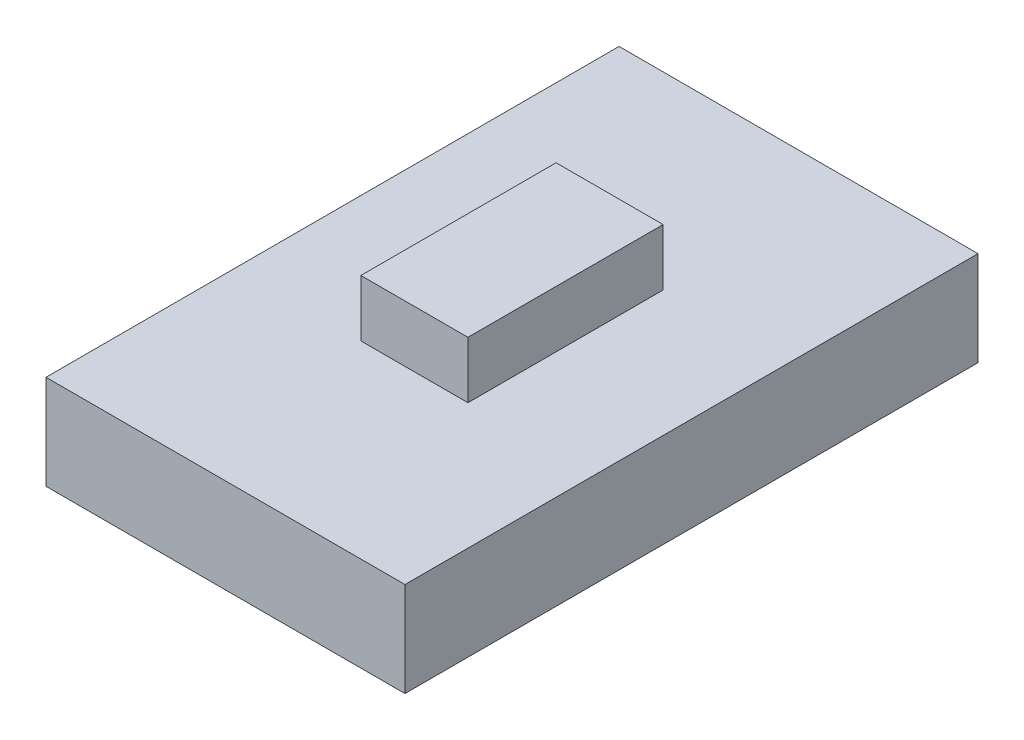
ISO-10303-21;
HEADER;
FILE_DESCRIPTION(('STEP AP214'),'2;1');
FILE_NAME('part.step','',(''),(''),'','','');
FILE_SCHEMA(('AUTOMOTIVE_DESIGN { 1 0 10303 214 1 1 1 1 }'));
ENDSEC;
DATA;
#1=APPLICATION_CONTEXT('core data for automotive mechanical design processes');
#2=APPLICATION_PROTOCOL_DEFINITION('international standard','automotive_design',2000,#1);
#3=PRODUCT_CONTEXT('',#1,'mechanical');
#4=PRODUCT('Part','Part','',(#3));
#5=PRODUCT_RELATED_PRODUCT_CATEGORY('part','',(#4));
#6=PRODUCT_DEFINITION_FORMATION('','',#4);
#7=PRODUCT_DEFINITION_CONTEXT('part definition',#1,'design');
#8=PRODUCT_DEFINITION('design','',#6,#7);
#9=PRODUCT_DEFINITION_SHAPE('','',#8);
#10=(LENGTH_UNIT() NAMED_UNIT(*) SI_UNIT(.MILLI.,.METRE.));
#11=(NAMED_UNIT(*) PLANE_ANGLE_UNIT() SI_UNIT($,.RADIAN.));
#12=(NAMED_UNIT(*) SI_UNIT($,.STERADIAN.) SOLID_ANGLE_UNIT());
#13=UNCERTAINTY_MEASURE_WITH_UNIT(LENGTH_MEASURE(1.E-05),#10,'distance_accuracy_value','');
#14=(GEOMETRIC_REPRESENTATION_CONTEXT(3) GLOBAL_UNCERTAINTY_ASSIGNED_CONTEXT((#13)) GLOBAL_UNIT_ASSIGNED_CONTEXT((#10,
#11,#12)) REPRESENTATION_CONTEXT('',''));
#15=CARTESIAN_POINT('',(0.,0.,0.));
#16=DIRECTION('',(0.,0.,1.));
#17=DIRECTION('',(1.,0.,0.));
#18=AXIS2_PLACEMENT_3D('',#15,#16,#17);
#19=CARTESIAN_POINT('',(0.85,0.45,0.));
#20=DIRECTION('',(0.,0.,-1.));
#21=DIRECTION('',(-1.,0.,0.));
#22=AXIS2_PLACEMENT_3D('',#19,#20,#21);
#23=PLANE('',#22);
#24=DIRECTION('',(1.,0.,0.));
#25=VECTOR('',#24,1.);
#26=CARTESIAN_POINT('',(0.85,0.,0.));
#27=LINE('',#26,#25);
#28=CARTESIAN_POINT('',(0.,0.,0.));
#29=VERTEX_POINT('',#28);
#30=CARTESIAN_POINT('',(0.85,0.,0.));
#31=VERTEX_POINT('',#30);
#32=EDGE_CURVE('E112',#29,#31,#27,.T.);
#33=ORIENTED_EDGE('',*,*,#32,.T.);
#34=DIRECTION('',(0.,-1.,0.));
#35=VECTOR('',#34,1.);
#36=CARTESIAN_POINT('',(0.85,0.45,0.));
#37=LINE('',#36,#35);
#38=CARTESIAN_POINT('',(0.85,0.45,0.));
#39=VERTEX_POINT('',#38);
#40=EDGE_CURVE('E11',#39,#31,#37,.T.);
#41=ORIENTED_EDGE('',*,*,#40,.F.);
#42=DIRECTION('',(1.,0.,0.));
#43=VECTOR('',#42,1.);
#44=CARTESIAN_POINT('',(0.85,0.45,0.));
#45=LINE('',#44,#43);
#46=CARTESIAN_POINT('',(0.,0.45,0.));
#47=VERTEX_POINT('',#46);
#48=EDGE_CURVE('E136',#47,#39,#45,.T.);
#49=ORIENTED_EDGE('',*,*,#48,.F.);
#50=DIRECTION('',(0.,-1.,0.));
#51=VECTOR('',#50,1.);
#52=CARTESIAN_POINT('',(0.,0.45,0.));
#53=LINE('',#52,#51);
#54=EDGE_CURVE('E144',#47,#29,#53,.T.);
#55=ORIENTED_EDGE('',*,*,#54,.T.);
#56=EDGE_LOOP('',(#33,#41,#49,#55));
#57=FACE_BOUND('',#56,.T.);
#58=ADVANCED_FACE('F34',(#57),#23,.F.);
#59=CARTESIAN_POINT('',(0.85,0.45,-1.55));
#60=DIRECTION('',(-1.,0.,0.));
#61=DIRECTION('',(0.,0.,1.));
#62=AXIS2_PLACEMENT_3D('',#59,#60,#61);
#63=PLANE('',#62);
#64=DIRECTION('',(0.,0.,-1.));
#65=VECTOR('',#64,1.);
#66=CARTESIAN_POINT('',(0.85,0.,-1.55));
#67=LINE('',#66,#65);
#68=CARTESIAN_POINT('',(0.85,0.,-1.55));
#69=VERTEX_POINT('',#68);
#70=EDGE_CURVE('E147',#31,#69,#67,.T.);
#71=ORIENTED_EDGE('',*,*,#70,.T.);
#72=DIRECTION('',(0.,-1.,0.));
#73=VECTOR('',#72,1.);
#74=CARTESIAN_POINT('',(0.85,0.45,-1.55));
#75=LINE('',#74,#73);
#76=CARTESIAN_POINT('',(0.85,0.45,-1.55));
#77=VERTEX_POINT('',#76);
#78=EDGE_CURVE('E42',#77,#69,#75,.T.);
#79=ORIENTED_EDGE('',*,*,#78,.F.);
#80=DIRECTION('',(0.,0.,-1.));
#81=VECTOR('',#80,1.);
#82=CARTESIAN_POINT('',(0.85,0.45,-1.55));
#83=LINE('',#82,#81);
#84=EDGE_CURVE('E138',#39,#77,#83,.T.);
#85=ORIENTED_EDGE('',*,*,#84,.F.);
#86=ORIENTED_EDGE('',*,*,#40,.T.);
#87=EDGE_LOOP('',(#71,#79,#85,#86));
#88=FACE_BOUND('',#87,.T.);
#89=ADVANCED_FACE('F167',(#88),#63,.F.);
#90=CARTESIAN_POINT('',(0.,0.45,-1.55));
#91=DIRECTION('',(0.,0.,1.));
#92=DIRECTION('',(1.,0.,0.));
#93=AXIS2_PLACEMENT_3D('',#90,#91,#92);
#94=PLANE('',#93);
#95=DIRECTION('',(-1.,0.,0.));
#96=VECTOR('',#95,1.);
#97=CARTESIAN_POINT('',(0.,0.,-1.55));
#98=LINE('',#97,#96);
#99=CARTESIAN_POINT('',(0.,0.,-1.55));
#100=VERTEX_POINT('',#99);
#101=EDGE_CURVE('E150',#69,#100,#98,.T.);
#102=ORIENTED_EDGE('',*,*,#101,.T.);
#103=DIRECTION('',(0.,-1.,0.));
#104=VECTOR('',#103,1.);
#105=CARTESIAN_POINT('',(0.,0.45,-1.55));
#106=LINE('',#105,#104);
#107=CARTESIAN_POINT('',(0.,0.45,-1.55));
#108=VERTEX_POINT('',#107);
#109=EDGE_CURVE('E157',#108,#100,#106,.T.);
#110=ORIENTED_EDGE('',*,*,#109,.F.);
#111=DIRECTION('',(-1.,0.,0.));
#112=VECTOR('',#111,1.);
#113=CARTESIAN_POINT('',(0.,0.45,-1.55));
#114=LINE('',#113,#112);
#115=EDGE_CURVE('E141',#77,#108,#114,.T.);
#116=ORIENTED_EDGE('',*,*,#115,.F.);
#117=ORIENTED_EDGE('',*,*,#78,.T.);
#118=EDGE_LOOP('',(#102,#110,#116,#117));
#119=FACE_BOUND('',#118,.T.);
#120=ADVANCED_FACE('F163',(#119),#94,.F.);
#121=CARTESIAN_POINT('',(0.,0.45,0.));
#122=DIRECTION('',(1.,0.,0.));
#123=DIRECTION('',(0.,0.,-1.));
#124=AXIS2_PLACEMENT_3D('',#121,#122,#123);
#125=PLANE('',#124);
#126=DIRECTION('',(0.,0.,1.));
#127=VECTOR('',#126,1.);
#128=CARTESIAN_POINT('',(0.,0.,0.));
#129=LINE('',#128,#127);
#130=EDGE_CURVE('E139',#100,#29,#129,.T.);
#131=ORIENTED_EDGE('',*,*,#130,.T.);
#132=ORIENTED_EDGE('',*,*,#54,.F.);
#133=DIRECTION('',(0.,0.,1.));
#134=VECTOR('',#133,1.);
#135=CARTESIAN_POINT('',(0.,0.45,0.));
#136=LINE('',#135,#134);
#137=EDGE_CURVE('E49',#108,#47,#136,.T.);
#138=ORIENTED_EDGE('',*,*,#137,.F.);
#139=ORIENTED_EDGE('',*,*,#109,.T.);
#140=EDGE_LOOP('',(#131,#132,#138,#139));
#141=FACE_BOUND('',#140,.T.);
#142=ADVANCED_FACE('F173',(#141),#125,.F.);
#143=CARTESIAN_POINT('',(0.,0.45,0.));
#144=DIRECTION('',(0.,-1.,0.));
#145=DIRECTION('',(0.,0.,-1.));
#146=AXIS2_PLACEMENT_3D('',#143,#144,#145);
#147=PLANE('',#146);
#148=ORIENTED_EDGE('',*,*,#48,.T.);
#149=ORIENTED_EDGE('',*,*,#84,.T.);
#150=ORIENTED_EDGE('',*,*,#115,.T.);
#151=ORIENTED_EDGE('',*,*,#137,.T.);
#152=EDGE_LOOP('',(#148,#149,#150,#151));
#153=FACE_BOUND('',#152,.T.);
#154=ADVANCED_FACE('F176',(#153),#147,.F.);
#155=CARTESIAN_POINT('',(0.425,-0.75,1.5));
#156=DIRECTION('',(0.,0.,-1.));
#157=DIRECTION('',(-1.,0.,0.));
#158=AXIS2_PLACEMENT_3D('',#155,#156,#157);
#159=PLANE('',#158);
#160=DIRECTION('',(-1.,0.,0.));
#161=VECTOR('',#160,1.);
#162=CARTESIAN_POINT('',(0.425,0.,1.5));
#163=LINE('',#162,#161);
#164=CARTESIAN_POINT('',(1.85,0.,1.5));
#165=VERTEX_POINT('',#164);
#166=CARTESIAN_POINT('',(-1.,0.,1.5));
#167=VERTEX_POINT('',#166);
#168=EDGE_CURVE('E109',#165,#167,#163,.T.);
#169=ORIENTED_EDGE('',*,*,#168,.T.);
#170=DIRECTION('',(0.,1.,0.));
#171=VECTOR('',#170,1.);
#172=CARTESIAN_POINT('',(-1.,-0.75,1.5));
#173=LINE('',#172,#171);
#174=CARTESIAN_POINT('',(-1.,-0.75,1.5));
#175=VERTEX_POINT('',#174);
#176=EDGE_CURVE('E107',#175,#167,#173,.T.);
#177=ORIENTED_EDGE('',*,*,#176,.F.);
#178=DIRECTION('',(-1.,0.,0.));
#179=VECTOR('',#178,1.);
#180=CARTESIAN_POINT('',(1.85,-0.75,1.5));
#181=LINE('',#180,#179);
#182=CARTESIAN_POINT('',(1.85,-0.75,1.5));
#183=VERTEX_POINT('',#182);
#184=EDGE_CURVE('E93',#183,#175,#181,.T.);
#185=ORIENTED_EDGE('',*,*,#184,.F.);
#186=DIRECTION('',(0.,1.,0.));
#187=VECTOR('',#186,1.);
#188=CARTESIAN_POINT('',(1.85,-0.75,1.5));
#189=LINE('',#188,#187);
#190=EDGE_CURVE('E123',#183,#165,#189,.T.);
#191=ORIENTED_EDGE('',*,*,#190,.T.);
#192=EDGE_LOOP('',(#169,#177,#185,#191));
#193=FACE_BOUND('',#192,.T.);
#194=ADVANCED_FACE('F108',(#193),#159,.F.);
#195=CARTESIAN_POINT('',(-1.,-0.75,1.5));
#196=DIRECTION('',(1.,0.,0.));
#197=DIRECTION('',(0.,0.,-1.));
#198=AXIS2_PLACEMENT_3D('',#195,#196,#197);
#199=PLANE('',#198);
#200=DIRECTION('',(0.,0.,-1.));
#201=VECTOR('',#200,1.);
#202=CARTESIAN_POINT('',(-1.,0.,1.5));
#203=LINE('',#202,#201);
#204=CARTESIAN_POINT('',(-1.,0.,-3.05));
#205=VERTEX_POINT('',#204);
#206=EDGE_CURVE('E125',#167,#205,#203,.T.);
#207=ORIENTED_EDGE('',*,*,#206,.T.);
#208=DIRECTION('',(0.,1.,0.));
#209=VECTOR('',#208,1.);
#210=CARTESIAN_POINT('',(-1.,-0.75,-3.05));
#211=LINE('',#210,#209);
#212=CARTESIAN_POINT('',(-1.,-0.75,-3.05));
#213=VERTEX_POINT('',#212);
#214=EDGE_CURVE('E113',#213,#205,#211,.T.);
#215=ORIENTED_EDGE('',*,*,#214,.F.);
#216=DIRECTION('',(0.,0.,-1.));
#217=VECTOR('',#216,1.);
#218=CARTESIAN_POINT('',(-1.,-0.75,1.5));
#219=LINE('',#218,#217);
#220=EDGE_CURVE('E97',#175,#213,#219,.T.);
#221=ORIENTED_EDGE('',*,*,#220,.F.);
#222=ORIENTED_EDGE('',*,*,#176,.T.);
#223=EDGE_LOOP('',(#207,#215,#221,#222));
#224=FACE_BOUND('',#223,.T.);
#225=ADVANCED_FACE('F115',(#224),#199,.F.);
#226=CARTESIAN_POINT('',(-1.,-0.75,-3.05));
#227=DIRECTION('',(0.,0.,1.));
#228=DIRECTION('',(1.,0.,0.));
#229=AXIS2_PLACEMENT_3D('',#226,#227,#228);
#230=PLANE('',#229);
#231=DIRECTION('',(1.,0.,0.));
#232=VECTOR('',#231,1.);
#233=CARTESIAN_POINT('',(-1.,0.,-3.05));
#234=LINE('',#233,#232);
#235=CARTESIAN_POINT('',(1.85,0.,-3.05));
#236=VERTEX_POINT('',#235);
#237=EDGE_CURVE('E127',#205,#236,#234,.T.);
#238=ORIENTED_EDGE('',*,*,#237,.T.);
#239=DIRECTION('',(0.,1.,0.));
#240=VECTOR('',#239,1.);
#241=CARTESIAN_POINT('',(1.85,-0.75,-3.05));
#242=LINE('',#241,#240);
#243=CARTESIAN_POINT('',(1.85,-0.75,-3.05));
#244=VERTEX_POINT('',#243);
#245=EDGE_CURVE('E132',#244,#236,#242,.T.);
#246=ORIENTED_EDGE('',*,*,#245,.F.);
#247=DIRECTION('',(1.,0.,0.));
#248=VECTOR('',#247,1.);
#249=CARTESIAN_POINT('',(-1.,-0.75,-3.05));
#250=LINE('',#249,#248);
#251=EDGE_CURVE('E118',#213,#244,#250,.T.);
#252=ORIENTED_EDGE('',*,*,#251,.F.);
#253=ORIENTED_EDGE('',*,*,#214,.T.);
#254=EDGE_LOOP('',(#238,#246,#252,#253));
#255=FACE_BOUND('',#254,.T.);
#256=ADVANCED_FACE('F216',(#255),#230,.F.);
#257=CARTESIAN_POINT('',(1.85,-0.75,-3.05));
#258=DIRECTION('',(-1.,0.,0.));
#259=DIRECTION('',(0.,0.,1.));
#260=AXIS2_PLACEMENT_3D('',#257,#258,#259);
#261=PLANE('',#260);
#262=DIRECTION('',(0.,0.,1.));
#263=VECTOR('',#262,1.);
#264=CARTESIAN_POINT('',(1.85,0.,-3.05));
#265=LINE('',#264,#263);
#266=EDGE_CURVE('E104',#236,#165,#265,.T.);
#267=ORIENTED_EDGE('',*,*,#266,.T.);
#268=ORIENTED_EDGE('',*,*,#190,.F.);
#269=DIRECTION('',(0.,0.,1.));
#270=VECTOR('',#269,1.);
#271=CARTESIAN_POINT('',(1.85,-0.75,-3.05));
#272=LINE('',#271,#270);
#273=EDGE_CURVE('E100',#244,#183,#272,.T.);
#274=ORIENTED_EDGE('',*,*,#273,.F.);
#275=ORIENTED_EDGE('',*,*,#245,.T.);
#276=EDGE_LOOP('',(#267,#268,#274,#275));
#277=FACE_BOUND('',#276,.T.);
#278=ADVANCED_FACE('F225',(#277),#261,.F.);
#279=CARTESIAN_POINT('',(0.,-0.75,0.));
#280=DIRECTION('',(0.,-1.,0.));
#281=DIRECTION('',(0.,0.,-1.));
#282=AXIS2_PLACEMENT_3D('',#279,#280,#281);
#283=PLANE('',#282);
#284=ORIENTED_EDGE('',*,*,#184,.T.);
#285=ORIENTED_EDGE('',*,*,#220,.T.);
#286=ORIENTED_EDGE('',*,*,#251,.T.);
#287=ORIENTED_EDGE('',*,*,#273,.T.);
#288=EDGE_LOOP('',(#284,#285,#286,#287));
#289=FACE_BOUND('',#288,.T.);
#290=ADVANCED_FACE('F95',(#289),#283,.T.);
#291=CARTESIAN_POINT('',(0.,0.,0.));
#292=DIRECTION('',(0.,-1.,0.));
#293=DIRECTION('',(0.,0.,-1.));
#294=AXIS2_PLACEMENT_3D('',#291,#292,#293);
#295=PLANE('',#294);
#296=ORIENTED_EDGE('',*,*,#32,.F.);
#297=ORIENTED_EDGE('',*,*,#130,.F.);
#298=ORIENTED_EDGE('',*,*,#101,.F.);
#299=ORIENTED_EDGE('',*,*,#70,.F.);
#300=EDGE_LOOP('',(#296,#297,#298,#299));
#301=FACE_BOUND('',#300,.T.);
#302=ORIENTED_EDGE('',*,*,#168,.F.);
#303=ORIENTED_EDGE('',*,*,#266,.F.);
#304=ORIENTED_EDGE('',*,*,#237,.F.);
#305=ORIENTED_EDGE('',*,*,#206,.F.);
#306=EDGE_LOOP('',(#302,#303,#304,#305));
#307=FACE_BOUND('',#306,.T.);
#308=ADVANCED_FACE('F170',(#301,#307),#295,.F.);
#309=CLOSED_SHELL('',(#58,#89,#120,#142,#154,#194,#225,#256,#278,#290,#308));
#310=MANIFOLD_SOLID_BREP('B2',#309);
#311=ADVANCED_BREP_SHAPE_REPRESENTATION('',(#18,#310),#14);
#312=SHAPE_DEFINITION_REPRESENTATION(#9,#311);
ENDSEC;
END-ISO-10303-21;
